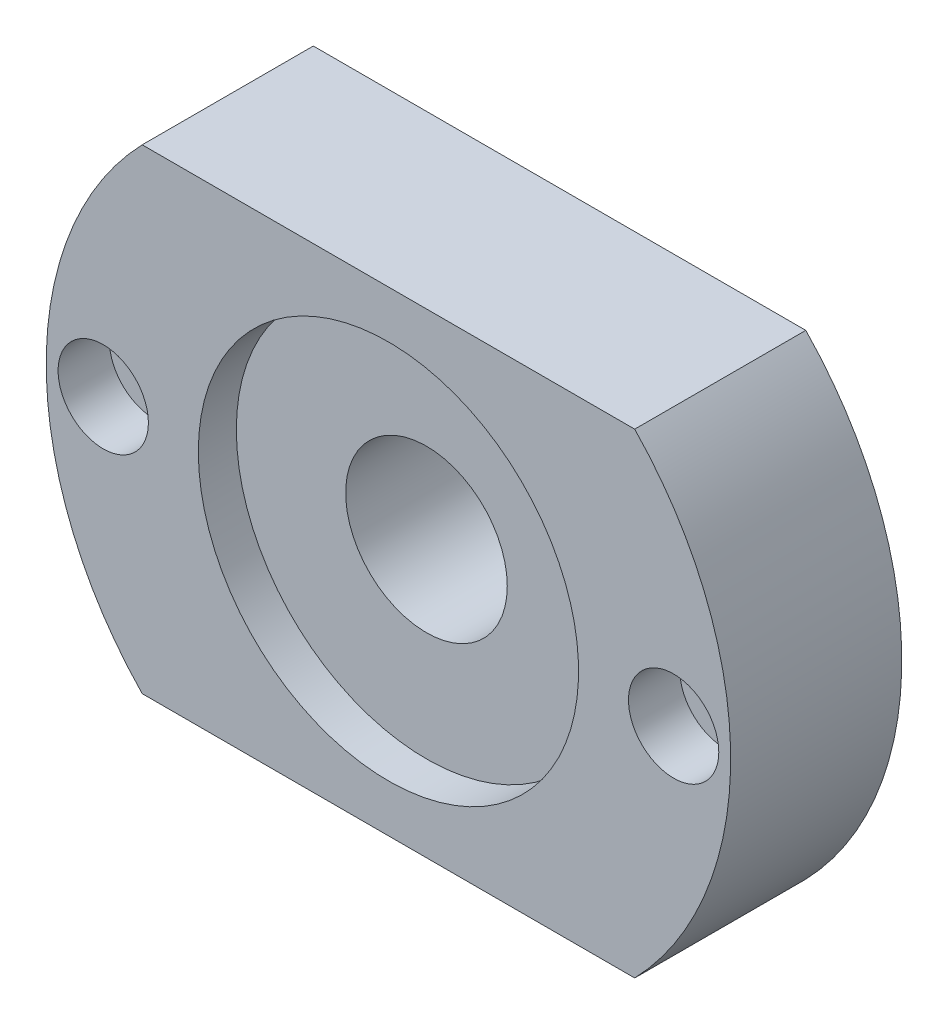
ISO-10303-21;
HEADER;
FILE_DESCRIPTION(('STEP AP214'),'2;1');
FILE_NAME('part.step','',(''),(''),'','','');
FILE_SCHEMA(('AUTOMOTIVE_DESIGN { 1 0 10303 214 1 1 1 1 }'));
ENDSEC;
DATA;
#1=APPLICATION_CONTEXT('core data for automotive mechanical design processes');
#2=APPLICATION_PROTOCOL_DEFINITION('international standard','automotive_design',2000,#1);
#3=PRODUCT_CONTEXT('',#1,'mechanical');
#4=PRODUCT('Part','Part','',(#3));
#5=PRODUCT_RELATED_PRODUCT_CATEGORY('part','',(#4));
#6=PRODUCT_DEFINITION_FORMATION('','',#4);
#7=PRODUCT_DEFINITION_CONTEXT('part definition',#1,'design');
#8=PRODUCT_DEFINITION('design','',#6,#7);
#9=PRODUCT_DEFINITION_SHAPE('','',#8);
#10=(LENGTH_UNIT() NAMED_UNIT(*) SI_UNIT(.MILLI.,.METRE.));
#11=(NAMED_UNIT(*) PLANE_ANGLE_UNIT() SI_UNIT($,.RADIAN.));
#12=(NAMED_UNIT(*) SI_UNIT($,.STERADIAN.) SOLID_ANGLE_UNIT());
#13=UNCERTAINTY_MEASURE_WITH_UNIT(LENGTH_MEASURE(1.E-05),#10,'distance_accuracy_value','');
#14=(GEOMETRIC_REPRESENTATION_CONTEXT(3) GLOBAL_UNCERTAINTY_ASSIGNED_CONTEXT((#13)) GLOBAL_UNIT_ASSIGNED_CONTEXT((#10,
#11,#12)) REPRESENTATION_CONTEXT('',''));
#15=CARTESIAN_POINT('',(0.,0.,0.));
#16=DIRECTION('',(0.,0.,1.));
#17=DIRECTION('',(1.,0.,0.));
#18=AXIS2_PLACEMENT_3D('',#15,#16,#17);
#19=CARTESIAN_POINT('',(510.810652388512,-401.151572168843,-662.825));
#20=DIRECTION('',(0.,0.,-1.));
#21=DIRECTION('',(-1.,0.,0.));
#22=AXIS2_PLACEMENT_3D('',#19,#20,#21);
#23=PLANE('',#22);
#24=CARTESIAN_POINT('',(476.510652388512,-401.151572168843,-662.825));
#25=DIRECTION('',(0.,0.,1.));
#26=DIRECTION('',(1.,0.,0.));
#27=AXIS2_PLACEMENT_3D('',#24,#25,#26);
#28=CIRCLE('',#27,8.5);
#29=CARTESIAN_POINT('',(485.010652388512,-401.151572168843,-662.825));
#30=VERTEX_POINT('',#29);
#31=EDGE_CURVE('E123',#30,#30,#28,.F.);
#32=ORIENTED_EDGE('',*,*,#31,.T.);
#33=EDGE_LOOP('',(#32));
#34=FACE_BOUND('',#33,.T.);
#35=CARTESIAN_POINT('',(476.510652388512,-401.151572168843,-662.825));
#36=DIRECTION('',(0.,0.,-1.));
#37=DIRECTION('',(-1.,0.,0.));
#38=AXIS2_PLACEMENT_3D('',#35,#36,#37);
#39=CIRCLE('',#38,20.);
#40=CARTESIAN_POINT('',(456.510652388512,-401.151572168843,-662.825));
#41=VERTEX_POINT('',#40);
#42=EDGE_CURVE('E20',#41,#41,#39,.F.);
#43=ORIENTED_EDGE('',*,*,#42,.T.);
#44=EDGE_LOOP('',(#43));
#45=FACE_BOUND('',#44,.T.);
#46=ADVANCED_FACE('F17',(#34,#45),#23,.F.);
#47=CARTESIAN_POINT('',(476.510652388512,-401.151572168843,-658.825));
#48=DIRECTION('',(0.,0.,-1.));
#49=DIRECTION('',(-1.,0.,0.));
#50=AXIS2_PLACEMENT_3D('',#47,#48,#49);
#51=CYLINDRICAL_SURFACE('',#50,20.);
#52=ORIENTED_EDGE('',*,*,#42,.F.);
#53=EDGE_LOOP('',(#52));
#54=FACE_BOUND('',#53,.T.);
#55=CARTESIAN_POINT('',(476.510652388512,-401.151572168843,-658.825));
#56=DIRECTION('',(0.,0.,-1.));
#57=DIRECTION('',(-1.,0.,0.));
#58=AXIS2_PLACEMENT_3D('',#55,#56,#57);
#59=CIRCLE('',#58,20.);
#60=CARTESIAN_POINT('',(456.510652388512,-401.151572168843,-658.825));
#61=VERTEX_POINT('',#60);
#62=EDGE_CURVE('E121',#61,#61,#59,.T.);
#63=ORIENTED_EDGE('',*,*,#62,.F.);
#64=EDGE_LOOP('',(#63));
#65=FACE_BOUND('',#64,.T.);
#66=ADVANCED_FACE('F131',(#54,#65),#51,.F.);
#67=CARTESIAN_POINT('',(476.510652388512,-401.151572168843,-676.825));
#68=DIRECTION('',(0.,0.,1.));
#69=DIRECTION('',(1.,0.,0.));
#70=AXIS2_PLACEMENT_3D('',#67,#68,#69);
#71=CYLINDRICAL_SURFACE('',#70,8.5);
#72=ORIENTED_EDGE('',*,*,#31,.F.);
#73=EDGE_LOOP('',(#72));
#74=FACE_BOUND('',#73,.T.);
#75=CARTESIAN_POINT('',(476.510652388512,-401.151572168843,-674.825));
#76=DIRECTION('',(0.,0.,1.));
#77=DIRECTION('',(1.,0.,0.));
#78=AXIS2_PLACEMENT_3D('',#75,#76,#77);
#79=CIRCLE('',#78,8.5);
#80=CARTESIAN_POINT('',(485.010652388512,-401.151572168843,-674.825));
#81=VERTEX_POINT('',#80);
#82=EDGE_CURVE('E112',#81,#81,#79,.T.);
#83=ORIENTED_EDGE('',*,*,#82,.F.);
#84=EDGE_LOOP('',(#83));
#85=FACE_BOUND('',#84,.T.);
#86=ADVANCED_FACE('F134',(#74,#85),#71,.F.);
#87=CARTESIAN_POINT('',(506.510652388512,-401.151572168843,-658.825));
#88=DIRECTION('',(0.,0.,1.));
#89=DIRECTION('',(1.,0.,0.));
#90=AXIS2_PLACEMENT_3D('',#87,#88,#89);
#91=CYLINDRICAL_SURFACE('',#90,4.75);
#92=CARTESIAN_POINT('',(506.510652388512,-401.151572168843,-658.825));
#93=DIRECTION('',(0.,0.,1.));
#94=DIRECTION('',(1.,0.,0.));
#95=AXIS2_PLACEMENT_3D('',#92,#93,#94);
#96=CIRCLE('',#95,4.75);
#97=CARTESIAN_POINT('',(511.260652388512,-401.151572168843,-658.825));
#98=VERTEX_POINT('',#97);
#99=EDGE_CURVE('E118',#98,#98,#96,.F.);
#100=ORIENTED_EDGE('',*,*,#99,.F.);
#101=EDGE_LOOP('',(#100));
#102=FACE_BOUND('',#101,.T.);
#103=CARTESIAN_POINT('',(506.510652388512,-401.151572168843,-664.225));
#104=DIRECTION('',(0.,0.,1.));
#105=DIRECTION('',(1.,0.,0.));
#106=AXIS2_PLACEMENT_3D('',#103,#104,#105);
#107=CIRCLE('',#106,4.75);
#108=CARTESIAN_POINT('',(511.260652388512,-401.151572168843,-664.225));
#109=VERTEX_POINT('',#108);
#110=EDGE_CURVE('E109',#109,#109,#107,.T.);
#111=ORIENTED_EDGE('',*,*,#110,.F.);
#112=EDGE_LOOP('',(#111));
#113=FACE_BOUND('',#112,.T.);
#114=ADVANCED_FACE('F150',(#102,#113),#91,.F.);
#115=CARTESIAN_POINT('',(446.510652388512,-401.151572168843,-658.825));
#116=DIRECTION('',(0.,0.,1.));
#117=DIRECTION('',(1.,0.,0.));
#118=AXIS2_PLACEMENT_3D('',#115,#116,#117);
#119=CYLINDRICAL_SURFACE('',#118,4.75);
#120=CARTESIAN_POINT('',(446.510652388512,-401.151572168843,-658.825));
#121=DIRECTION('',(0.,0.,1.));
#122=DIRECTION('',(1.,0.,0.));
#123=AXIS2_PLACEMENT_3D('',#120,#121,#122);
#124=CIRCLE('',#123,4.75);
#125=CARTESIAN_POINT('',(451.260652388512,-401.151572168843,-658.825));
#126=VERTEX_POINT('',#125);
#127=EDGE_CURVE('E115',#126,#126,#124,.F.);
#128=ORIENTED_EDGE('',*,*,#127,.F.);
#129=EDGE_LOOP('',(#128));
#130=FACE_BOUND('',#129,.T.);
#131=CARTESIAN_POINT('',(446.510652388512,-401.151572168843,-664.225));
#132=DIRECTION('',(0.,0.,1.));
#133=DIRECTION('',(1.,0.,0.));
#134=AXIS2_PLACEMENT_3D('',#131,#132,#133);
#135=CIRCLE('',#134,4.75);
#136=CARTESIAN_POINT('',(451.260652388512,-401.151572168843,-664.225));
#137=VERTEX_POINT('',#136);
#138=EDGE_CURVE('E76',#137,#137,#135,.T.);
#139=ORIENTED_EDGE('',*,*,#138,.F.);
#140=EDGE_LOOP('',(#139));
#141=FACE_BOUND('',#140,.T.);
#142=ADVANCED_FACE('F139',(#130,#141),#119,.F.);
#143=CARTESIAN_POINT('',(401.510652388512,-401.151572168843,-658.825));
#144=DIRECTION('',(0.,0.,1.));
#145=DIRECTION('',(1.,0.,0.));
#146=AXIS2_PLACEMENT_3D('',#143,#144,#145);
#147=PLANE('',#146);
#148=ORIENTED_EDGE('',*,*,#127,.T.);
#149=EDGE_LOOP('',(#148));
#150=FACE_BOUND('',#149,.T.);
#151=ORIENTED_EDGE('',*,*,#99,.T.);
#152=EDGE_LOOP('',(#151));
#153=FACE_BOUND('',#152,.T.);
#154=ORIENTED_EDGE('',*,*,#62,.T.);
#155=EDGE_LOOP('',(#154));
#156=FACE_BOUND('',#155,.T.);
#157=DIRECTION('',(1.,0.,0.));
#158=VECTOR('',#157,1.);
#159=CARTESIAN_POINT('',(502.414320082489,-426.151572168843,-658.825));
#160=LINE('',#159,#158);
#161=CARTESIAN_POINT('',(502.414320082489,-426.151572168843,-658.825));
#162=VERTEX_POINT('',#161);
#163=CARTESIAN_POINT('',(450.606984694534,-426.151572168843,-658.825));
#164=VERTEX_POINT('',#163);
#165=EDGE_CURVE('E54',#162,#164,#160,.F.);
#166=ORIENTED_EDGE('',*,*,#165,.F.);
#167=CARTESIAN_POINT('',(476.510652388512,-401.151572168843,-658.825));
#168=DIRECTION('',(0.,0.,1.));
#169=DIRECTION('',(1.,0.,0.));
#170=AXIS2_PLACEMENT_3D('',#167,#168,#169);
#171=CIRCLE('',#170,36.);
#172=CARTESIAN_POINT('',(502.414320082489,-376.151572168843,-658.825));
#173=VERTEX_POINT('',#172);
#174=EDGE_CURVE('E72',#173,#162,#171,.F.);
#175=ORIENTED_EDGE('',*,*,#174,.F.);
#176=DIRECTION('',(-1.,0.,0.));
#177=VECTOR('',#176,1.);
#178=CARTESIAN_POINT('',(450.606984694534,-376.151572168843,-658.825));
#179=LINE('',#178,#177);
#180=CARTESIAN_POINT('',(450.606984694535,-376.151572168843,-658.825));
#181=VERTEX_POINT('',#180);
#182=EDGE_CURVE('E68',#181,#173,#179,.F.);
#183=ORIENTED_EDGE('',*,*,#182,.F.);
#184=CARTESIAN_POINT('',(476.510652388512,-401.151572168843,-658.825));
#185=DIRECTION('',(0.,0.,1.));
#186=DIRECTION('',(1.,0.,0.));
#187=AXIS2_PLACEMENT_3D('',#184,#185,#186);
#188=CIRCLE('',#187,36.);
#189=EDGE_CURVE('E59',#164,#181,#188,.F.);
#190=ORIENTED_EDGE('',*,*,#189,.F.);
#191=EDGE_LOOP('',(#166,#175,#183,#190));
#192=FACE_BOUND('',#191,.T.);
#193=ADVANCED_FACE('F71',(#150,#153,#156,#192),#147,.T.);
#194=CARTESIAN_POINT('',(510.810652388512,-401.151572168843,-674.825));
#195=DIRECTION('',(0.,0.,-1.));
#196=DIRECTION('',(-1.,0.,0.));
#197=AXIS2_PLACEMENT_3D('',#194,#195,#196);
#198=PLANE('',#197);
#199=ORIENTED_EDGE('',*,*,#82,.T.);
#200=EDGE_LOOP('',(#199));
#201=FACE_BOUND('',#200,.T.);
#202=CARTESIAN_POINT('',(476.510652388512,-401.151572168843,-674.825));
#203=DIRECTION('',(0.,0.,-1.));
#204=DIRECTION('',(-1.,0.,0.));
#205=AXIS2_PLACEMENT_3D('',#202,#203,#204);
#206=CIRCLE('',#205,17.);
#207=CARTESIAN_POINT('',(459.510652388512,-401.151572168843,-674.825));
#208=VERTEX_POINT('',#207);
#209=EDGE_CURVE('E102',#208,#208,#206,.T.);
#210=ORIENTED_EDGE('',*,*,#209,.T.);
#211=EDGE_LOOP('',(#210));
#212=FACE_BOUND('',#211,.T.);
#213=ADVANCED_FACE('F138',(#201,#212),#198,.T.);
#214=CARTESIAN_POINT('',(401.510652388512,-401.151572168843,-664.225));
#215=DIRECTION('',(0.,0.,1.));
#216=DIRECTION('',(1.,0.,0.));
#217=AXIS2_PLACEMENT_3D('',#214,#215,#216);
#218=PLANE('',#217);
#219=CARTESIAN_POINT('',(506.510652388512,-401.151572168843,-664.225));
#220=DIRECTION('',(0.,0.,1.));
#221=DIRECTION('',(1.,0.,0.));
#222=AXIS2_PLACEMENT_3D('',#219,#220,#221);
#223=CIRCLE('',#222,2.6);
#224=CARTESIAN_POINT('',(509.110652388512,-401.151572168843,-664.225));
#225=VERTEX_POINT('',#224);
#226=EDGE_CURVE('E99',#225,#225,#223,.F.);
#227=ORIENTED_EDGE('',*,*,#226,.T.);
#228=EDGE_LOOP('',(#227));
#229=FACE_BOUND('',#228,.T.);
#230=ORIENTED_EDGE('',*,*,#110,.T.);
#231=EDGE_LOOP('',(#230));
#232=FACE_BOUND('',#231,.T.);
#233=ADVANCED_FACE('F147',(#229,#232),#218,.T.);
#234=CARTESIAN_POINT('',(401.510652388512,-401.151572168843,-664.225));
#235=DIRECTION('',(0.,0.,1.));
#236=DIRECTION('',(1.,0.,0.));
#237=AXIS2_PLACEMENT_3D('',#234,#235,#236);
#238=PLANE('',#237);
#239=CARTESIAN_POINT('',(446.510652388512,-401.151572168843,-664.225));
#240=DIRECTION('',(0.,0.,1.));
#241=DIRECTION('',(1.,0.,0.));
#242=AXIS2_PLACEMENT_3D('',#239,#240,#241);
#243=CIRCLE('',#242,2.6);
#244=CARTESIAN_POINT('',(449.110652388512,-401.151572168843,-664.225));
#245=VERTEX_POINT('',#244);
#246=EDGE_CURVE('E96',#245,#245,#243,.F.);
#247=ORIENTED_EDGE('',*,*,#246,.T.);
#248=EDGE_LOOP('',(#247));
#249=FACE_BOUND('',#248,.T.);
#250=ORIENTED_EDGE('',*,*,#138,.T.);
#251=EDGE_LOOP('',(#250));
#252=FACE_BOUND('',#251,.T.);
#253=ADVANCED_FACE('F185',(#249,#252),#238,.T.);
#254=CARTESIAN_POINT('',(450.606984694534,-376.151572168843,-676.825));
#255=DIRECTION('',(0.,1.,0.));
#256=DIRECTION('',(-1.,0.,0.));
#257=AXIS2_PLACEMENT_3D('',#254,#255,#256);
#258=PLANE('',#257);
#259=ORIENTED_EDGE('',*,*,#182,.T.);
#260=DIRECTION('',(0.,0.,1.));
#261=VECTOR('',#260,1.);
#262=CARTESIAN_POINT('',(502.414320082489,-376.151572168843,-676.825));
#263=LINE('',#262,#261);
#264=CARTESIAN_POINT('',(502.414320082489,-376.151572168843,-676.825));
#265=VERTEX_POINT('',#264);
#266=EDGE_CURVE('E105',#265,#173,#263,.T.);
#267=ORIENTED_EDGE('',*,*,#266,.F.);
#268=DIRECTION('',(1.,0.,0.));
#269=VECTOR('',#268,1.);
#270=CARTESIAN_POINT('',(401.510652388512,-376.151572168843,-676.825));
#271=LINE('',#270,#269);
#272=CARTESIAN_POINT('',(450.606984694535,-376.151572168843,-676.825));
#273=VERTEX_POINT('',#272);
#274=EDGE_CURVE('E80',#265,#273,#271,.F.);
#275=ORIENTED_EDGE('',*,*,#274,.T.);
#276=DIRECTION('',(0.,0.,1.));
#277=VECTOR('',#276,1.);
#278=CARTESIAN_POINT('',(450.606984694534,-376.151572168843,-676.825));
#279=LINE('',#278,#277);
#280=EDGE_CURVE('E64',#181,#273,#279,.F.);
#281=ORIENTED_EDGE('',*,*,#280,.F.);
#282=EDGE_LOOP('',(#259,#267,#275,#281));
#283=FACE_BOUND('',#282,.T.);
#284=ADVANCED_FACE('F79',(#283),#258,.T.);
#285=CARTESIAN_POINT('',(476.510652388512,-401.151572168843,-676.825));
#286=DIRECTION('',(0.,0.,1.));
#287=DIRECTION('',(1.,0.,0.));
#288=AXIS2_PLACEMENT_3D('',#285,#286,#287);
#289=CYLINDRICAL_SURFACE('',#288,36.);
#290=ORIENTED_EDGE('',*,*,#189,.T.);
#291=ORIENTED_EDGE('',*,*,#280,.T.);
#292=CARTESIAN_POINT('',(476.510652388512,-401.151572168843,-676.825));
#293=DIRECTION('',(0.,0.,1.));
#294=DIRECTION('',(1.,0.,0.));
#295=AXIS2_PLACEMENT_3D('',#292,#293,#294);
#296=CIRCLE('',#295,36.);
#297=CARTESIAN_POINT('',(450.606984694534,-426.151572168843,-676.825));
#298=VERTEX_POINT('',#297);
#299=EDGE_CURVE('E94',#273,#298,#296,.T.);
#300=ORIENTED_EDGE('',*,*,#299,.T.);
#301=DIRECTION('',(0.,0.,-1.));
#302=VECTOR('',#301,1.);
#303=CARTESIAN_POINT('',(450.606984694534,-426.151572168843,-676.825));
#304=LINE('',#303,#302);
#305=EDGE_CURVE('E66',#164,#298,#304,.T.);
#306=ORIENTED_EDGE('',*,*,#305,.F.);
#307=EDGE_LOOP('',(#290,#291,#300,#306));
#308=FACE_BOUND('',#307,.T.);
#309=ADVANCED_FACE('F61',(#308),#289,.T.);
#310=CARTESIAN_POINT('',(502.414320082489,-426.151572168843,-676.825));
#311=DIRECTION('',(0.,-1.,0.));
#312=DIRECTION('',(0.,0.,-1.));
#313=AXIS2_PLACEMENT_3D('',#310,#311,#312);
#314=PLANE('',#313);
#315=ORIENTED_EDGE('',*,*,#165,.T.);
#316=ORIENTED_EDGE('',*,*,#305,.T.);
#317=DIRECTION('',(1.,0.,0.));
#318=VECTOR('',#317,1.);
#319=CARTESIAN_POINT('',(401.510652388512,-426.151572168843,-676.825));
#320=LINE('',#319,#318);
#321=CARTESIAN_POINT('',(502.414320082489,-426.151572168843,-676.825));
#322=VERTEX_POINT('',#321);
#323=EDGE_CURVE('E93',#298,#322,#320,.T.);
#324=ORIENTED_EDGE('',*,*,#323,.T.);
#325=DIRECTION('',(0.,0.,1.));
#326=VECTOR('',#325,1.);
#327=CARTESIAN_POINT('',(502.414320082489,-426.151572168843,-676.825));
#328=LINE('',#327,#326);
#329=EDGE_CURVE('E35',#162,#322,#328,.F.);
#330=ORIENTED_EDGE('',*,*,#329,.F.);
#331=EDGE_LOOP('',(#315,#316,#324,#330));
#332=FACE_BOUND('',#331,.T.);
#333=ADVANCED_FACE('F178',(#332),#314,.T.);
#334=CARTESIAN_POINT('',(476.510652388512,-401.151572168843,-676.825));
#335=DIRECTION('',(0.,0.,1.));
#336=DIRECTION('',(1.,0.,0.));
#337=AXIS2_PLACEMENT_3D('',#334,#335,#336);
#338=CYLINDRICAL_SURFACE('',#337,36.);
#339=ORIENTED_EDGE('',*,*,#174,.T.);
#340=ORIENTED_EDGE('',*,*,#329,.T.);
#341=CARTESIAN_POINT('',(476.510652388512,-401.151572168843,-676.825));
#342=DIRECTION('',(0.,0.,1.));
#343=DIRECTION('',(1.,0.,0.));
#344=AXIS2_PLACEMENT_3D('',#341,#342,#343);
#345=CIRCLE('',#344,36.);
#346=EDGE_CURVE('E91',#322,#265,#345,.T.);
#347=ORIENTED_EDGE('',*,*,#346,.T.);
#348=ORIENTED_EDGE('',*,*,#266,.T.);
#349=EDGE_LOOP('',(#339,#340,#347,#348));
#350=FACE_BOUND('',#349,.T.);
#351=ADVANCED_FACE('F174',(#350),#338,.T.);
#352=CARTESIAN_POINT('',(476.510652388512,-401.151572168843,-676.825));
#353=DIRECTION('',(0.,0.,-1.));
#354=DIRECTION('',(-1.,0.,0.));
#355=AXIS2_PLACEMENT_3D('',#352,#353,#354);
#356=CYLINDRICAL_SURFACE('',#355,17.);
#357=CARTESIAN_POINT('',(476.510652388512,-401.151572168843,-676.825));
#358=DIRECTION('',(0.,0.,-1.));
#359=DIRECTION('',(-1.,0.,0.));
#360=AXIS2_PLACEMENT_3D('',#357,#358,#359);
#361=CIRCLE('',#360,17.);
#362=CARTESIAN_POINT('',(459.510652388512,-401.151572168843,-676.825));
#363=VERTEX_POINT('',#362);
#364=EDGE_CURVE('E88',#363,#363,#361,.T.);
#365=ORIENTED_EDGE('',*,*,#364,.T.);
#366=EDGE_LOOP('',(#365));
#367=FACE_BOUND('',#366,.T.);
#368=ORIENTED_EDGE('',*,*,#209,.F.);
#369=EDGE_LOOP('',(#368));
#370=FACE_BOUND('',#369,.T.);
#371=ADVANCED_FACE('F170',(#367,#370),#356,.F.);
#372=CARTESIAN_POINT('',(506.510652388512,-401.151572168843,-676.825));
#373=DIRECTION('',(0.,0.,1.));
#374=DIRECTION('',(1.,0.,0.));
#375=AXIS2_PLACEMENT_3D('',#372,#373,#374);
#376=CYLINDRICAL_SURFACE('',#375,2.6);
#377=CARTESIAN_POINT('',(506.510652388512,-401.151572168843,-676.825));
#378=DIRECTION('',(0.,0.,1.));
#379=DIRECTION('',(1.,0.,0.));
#380=AXIS2_PLACEMENT_3D('',#377,#378,#379);
#381=CIRCLE('',#380,2.6);
#382=CARTESIAN_POINT('',(509.110652388512,-401.151572168843,-676.825));
#383=VERTEX_POINT('',#382);
#384=EDGE_CURVE('E26',#383,#383,#381,.F.);
#385=ORIENTED_EDGE('',*,*,#384,.T.);
#386=EDGE_LOOP('',(#385));
#387=FACE_BOUND('',#386,.T.);
#388=ORIENTED_EDGE('',*,*,#226,.F.);
#389=EDGE_LOOP('',(#388));
#390=FACE_BOUND('',#389,.T.);
#391=ADVANCED_FACE('F162',(#387,#390),#376,.F.);
#392=CARTESIAN_POINT('',(446.510652388512,-401.151572168843,-676.825));
#393=DIRECTION('',(0.,0.,1.));
#394=DIRECTION('',(1.,0.,0.));
#395=AXIS2_PLACEMENT_3D('',#392,#393,#394);
#396=CYLINDRICAL_SURFACE('',#395,2.6);
#397=CARTESIAN_POINT('',(446.510652388512,-401.151572168843,-676.825));
#398=DIRECTION('',(0.,0.,1.));
#399=DIRECTION('',(1.,0.,0.));
#400=AXIS2_PLACEMENT_3D('',#397,#398,#399);
#401=CIRCLE('',#400,2.6);
#402=CARTESIAN_POINT('',(449.110652388512,-401.151572168843,-676.825));
#403=VERTEX_POINT('',#402);
#404=EDGE_CURVE('E11',#403,#403,#401,.F.);
#405=ORIENTED_EDGE('',*,*,#404,.T.);
#406=EDGE_LOOP('',(#405));
#407=FACE_BOUND('',#406,.T.);
#408=ORIENTED_EDGE('',*,*,#246,.F.);
#409=EDGE_LOOP('',(#408));
#410=FACE_BOUND('',#409,.T.);
#411=ADVANCED_FACE('F156',(#407,#410),#396,.F.);
#412=CARTESIAN_POINT('',(401.510652388512,-401.151572168843,-676.825));
#413=DIRECTION('',(0.,0.,1.));
#414=DIRECTION('',(1.,0.,0.));
#415=AXIS2_PLACEMENT_3D('',#412,#413,#414);
#416=PLANE('',#415);
#417=ORIENTED_EDGE('',*,*,#404,.F.);
#418=EDGE_LOOP('',(#417));
#419=FACE_BOUND('',#418,.T.);
#420=ORIENTED_EDGE('',*,*,#384,.F.);
#421=EDGE_LOOP('',(#420));
#422=FACE_BOUND('',#421,.T.);
#423=ORIENTED_EDGE('',*,*,#364,.F.);
#424=EDGE_LOOP('',(#423));
#425=FACE_BOUND('',#424,.T.);
#426=ORIENTED_EDGE('',*,*,#323,.F.);
#427=ORIENTED_EDGE('',*,*,#299,.F.);
#428=ORIENTED_EDGE('',*,*,#274,.F.);
#429=ORIENTED_EDGE('',*,*,#346,.F.);
#430=EDGE_LOOP('',(#426,#427,#428,#429));
#431=FACE_BOUND('',#430,.T.);
#432=ADVANCED_FACE('F154',(#419,#422,#425,#431),#416,.F.);
#433=CLOSED_SHELL('',(#46,#66,#86,#114,#142,#193,#213,#233,#253,#284,#309,#333,#351,#371,#391,
#411,#432));
#434=MANIFOLD_SOLID_BREP('B1',#433);
#435=ADVANCED_BREP_SHAPE_REPRESENTATION('',(#18,#434),#14);
#436=SHAPE_DEFINITION_REPRESENTATION(#9,#435);
ENDSEC;
END-ISO-10303-21;
